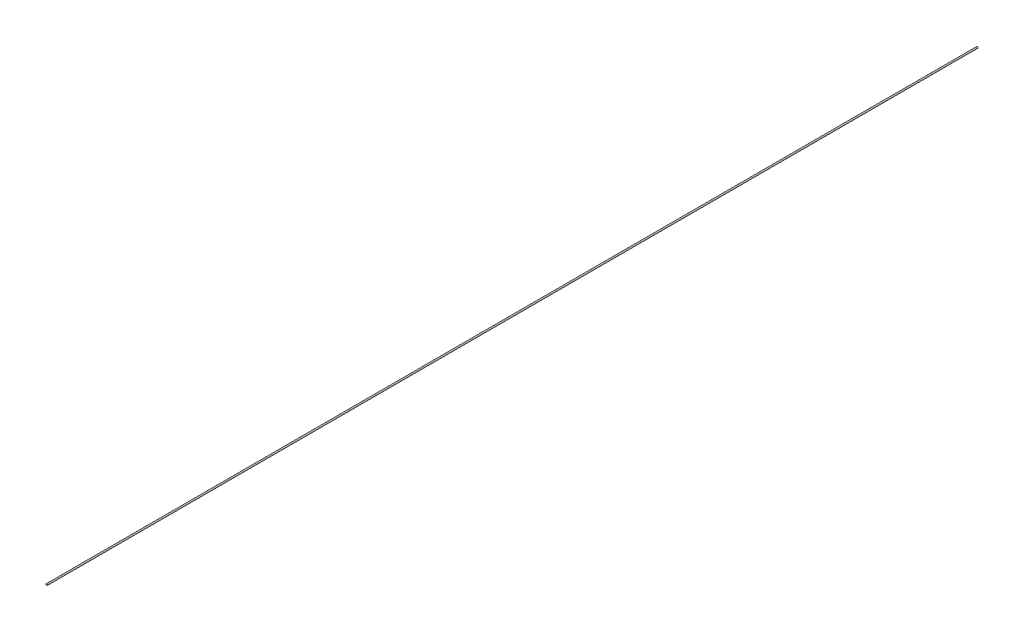
ISO-10303-21;
HEADER;
FILE_DESCRIPTION(('STEP AP214'),'2;1');
FILE_NAME('part.step','',(''),(''),'','','');
FILE_SCHEMA(('AUTOMOTIVE_DESIGN { 1 0 10303 214 1 1 1 1 }'));
ENDSEC;
DATA;
#1=APPLICATION_CONTEXT('core data for automotive mechanical design processes');
#2=APPLICATION_PROTOCOL_DEFINITION('international standard','automotive_design',2000,#1);
#3=PRODUCT_CONTEXT('',#1,'mechanical');
#4=PRODUCT('Part','Part','',(#3));
#5=PRODUCT_RELATED_PRODUCT_CATEGORY('part','',(#4));
#6=PRODUCT_DEFINITION_FORMATION('','',#4);
#7=PRODUCT_DEFINITION_CONTEXT('part definition',#1,'design');
#8=PRODUCT_DEFINITION('design','',#6,#7);
#9=PRODUCT_DEFINITION_SHAPE('','',#8);
#10=(LENGTH_UNIT() NAMED_UNIT(*) SI_UNIT(.MILLI.,.METRE.));
#11=(NAMED_UNIT(*) PLANE_ANGLE_UNIT() SI_UNIT($,.RADIAN.));
#12=(NAMED_UNIT(*) SI_UNIT($,.STERADIAN.) SOLID_ANGLE_UNIT());
#13=UNCERTAINTY_MEASURE_WITH_UNIT(LENGTH_MEASURE(1.E-05),#10,'distance_accuracy_value','');
#14=(GEOMETRIC_REPRESENTATION_CONTEXT(3) GLOBAL_UNCERTAINTY_ASSIGNED_CONTEXT((#13)) GLOBAL_UNIT_ASSIGNED_CONTEXT((#10,
#11,#12)) REPRESENTATION_CONTEXT('',''));
#15=CARTESIAN_POINT('',(0.,0.,0.));
#16=DIRECTION('',(0.,0.,1.));
#17=DIRECTION('',(1.,0.,0.));
#18=AXIS2_PLACEMENT_3D('',#15,#16,#17);
#19=CARTESIAN_POINT('',(0.,0.,125.));
#20=DIRECTION('',(0.,0.,-1.));
#21=DIRECTION('',(-1.,0.,0.));
#22=AXIS2_PLACEMENT_3D('',#19,#20,#21);
#23=CYLINDRICAL_SURFACE('',#22,0.1);
#24=CARTESIAN_POINT('',(0.,0.,125.));
#25=DIRECTION('',(0.,0.,1.));
#26=DIRECTION('',(1.,0.,0.));
#27=AXIS2_PLACEMENT_3D('',#24,#25,#26);
#28=CIRCLE('',#27,0.1);
#29=CARTESIAN_POINT('',(0.1,0.,125.));
#30=VERTEX_POINT('',#29);
#31=EDGE_CURVE('E10',#30,#30,#28,.T.);
#32=ORIENTED_EDGE('',*,*,#31,.F.);
#33=EDGE_LOOP('',(#32));
#34=FACE_BOUND('',#33,.T.);
#35=CARTESIAN_POINT('',(0.,0.,0.));
#36=DIRECTION('',(0.,0.,1.));
#37=DIRECTION('',(1.,0.,0.));
#38=AXIS2_PLACEMENT_3D('',#35,#36,#37);
#39=CIRCLE('',#38,0.1);
#40=CARTESIAN_POINT('',(0.1,0.,0.));
#41=VERTEX_POINT('',#40);
#42=EDGE_CURVE('E34',#41,#41,#39,.T.);
#43=ORIENTED_EDGE('',*,*,#42,.T.);
#44=EDGE_LOOP('',(#43));
#45=FACE_BOUND('',#44,.T.);
#46=ADVANCED_FACE('F31',(#34,#45),#23,.T.);
#47=CARTESIAN_POINT('',(0.,0.,125.));
#48=DIRECTION('',(0.,0.,1.));
#49=DIRECTION('',(1.,0.,0.));
#50=AXIS2_PLACEMENT_3D('',#47,#48,#49);
#51=PLANE('',#50);
#52=ORIENTED_EDGE('',*,*,#31,.T.);
#53=EDGE_LOOP('',(#52));
#54=FACE_BOUND('',#53,.T.);
#55=ADVANCED_FACE('F46',(#54),#51,.T.);
#56=CARTESIAN_POINT('',(0.,0.,0.));
#57=DIRECTION('',(0.,0.,1.));
#58=DIRECTION('',(1.,0.,0.));
#59=AXIS2_PLACEMENT_3D('',#56,#57,#58);
#60=PLANE('',#59);
#61=ORIENTED_EDGE('',*,*,#42,.F.);
#62=EDGE_LOOP('',(#61));
#63=FACE_BOUND('',#62,.T.);
#64=ADVANCED_FACE('F44',(#63),#60,.F.);
#65=CLOSED_SHELL('',(#46,#55,#64));
#66=MANIFOLD_SOLID_BREP('B2',#65);
#67=ADVANCED_BREP_SHAPE_REPRESENTATION('',(#18,#66),#14);
#68=SHAPE_DEFINITION_REPRESENTATION(#9,#67);
ENDSEC;
END-ISO-10303-21;
